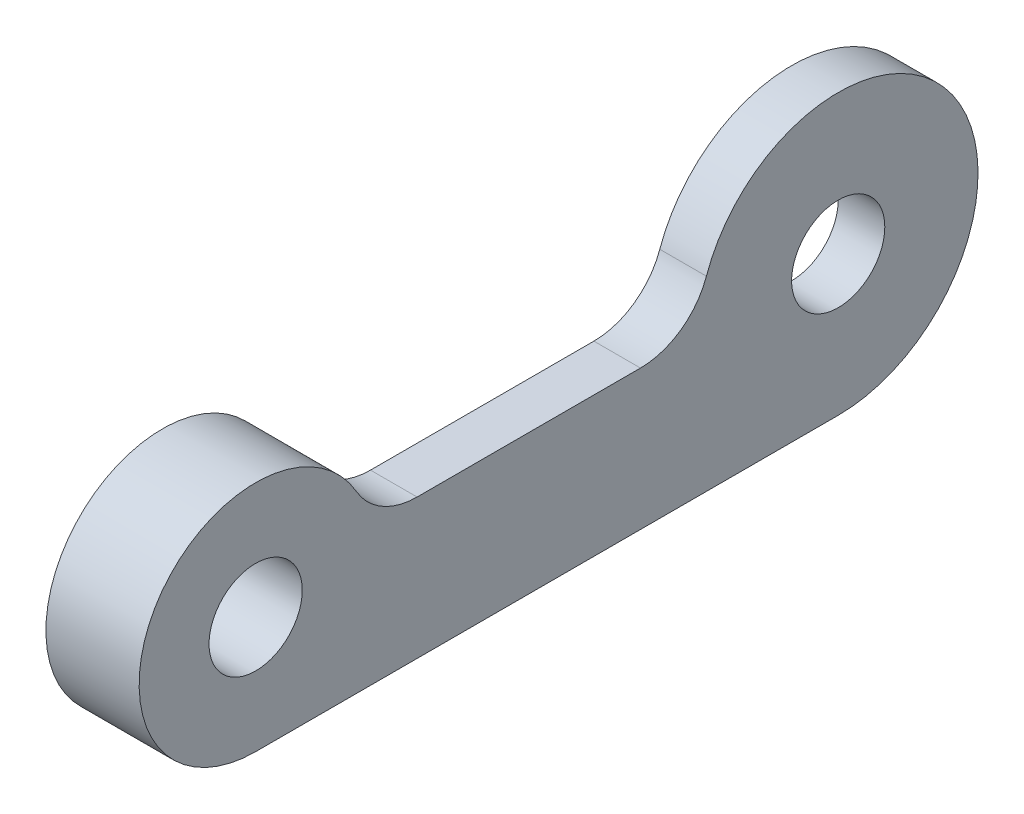
ISO-10303-21;
HEADER;
FILE_DESCRIPTION(('STEP AP214'),'2;1');
FILE_NAME('part.step','',(''),(''),'','','');
FILE_SCHEMA(('AUTOMOTIVE_DESIGN { 1 0 10303 214 1 1 1 1 }'));
ENDSEC;
DATA;
#1=APPLICATION_CONTEXT('core data for automotive mechanical design processes');
#2=APPLICATION_PROTOCOL_DEFINITION('international standard','automotive_design',2000,#1);
#3=PRODUCT_CONTEXT('',#1,'mechanical');
#4=PRODUCT('Part','Part','',(#3));
#5=PRODUCT_RELATED_PRODUCT_CATEGORY('part','',(#4));
#6=PRODUCT_DEFINITION_FORMATION('','',#4);
#7=PRODUCT_DEFINITION_CONTEXT('part definition',#1,'design');
#8=PRODUCT_DEFINITION('design','',#6,#7);
#9=PRODUCT_DEFINITION_SHAPE('','',#8);
#10=(LENGTH_UNIT() NAMED_UNIT(*) SI_UNIT(.MILLI.,.METRE.));
#11=(NAMED_UNIT(*) PLANE_ANGLE_UNIT() SI_UNIT($,.RADIAN.));
#12=(NAMED_UNIT(*) SI_UNIT($,.STERADIAN.) SOLID_ANGLE_UNIT());
#13=UNCERTAINTY_MEASURE_WITH_UNIT(LENGTH_MEASURE(1.E-05),#10,'distance_accuracy_value','');
#14=(GEOMETRIC_REPRESENTATION_CONTEXT(3) GLOBAL_UNCERTAINTY_ASSIGNED_CONTEXT((#13)) GLOBAL_UNIT_ASSIGNED_CONTEXT((#10,
#11,#12)) REPRESENTATION_CONTEXT('',''));
#15=CARTESIAN_POINT('',(0.,0.,0.));
#16=DIRECTION('',(0.,0.,1.));
#17=DIRECTION('',(1.,0.,0.));
#18=AXIS2_PLACEMENT_3D('',#15,#16,#17);
#19=CARTESIAN_POINT('',(2.,-1.,0.));
#20=DIRECTION('',(1.,0.,0.));
#21=DIRECTION('',(0.,0.,-1.));
#22=AXIS2_PLACEMENT_3D('',#19,#20,#21);
#23=PLANE('',#22);
#24=CARTESIAN_POINT('',(2.,-1.,0.));
#25=DIRECTION('',(1.,0.,0.));
#26=DIRECTION('',(0.,0.,-1.));
#27=AXIS2_PLACEMENT_3D('',#24,#25,#26);
#28=CIRCLE('',#27,2.);
#29=CARTESIAN_POINT('',(2.,-1.,-2.));
#30=VERTEX_POINT('',#29);
#31=EDGE_CURVE('E169',#30,#30,#28,.T.);
#32=ORIENTED_EDGE('',*,*,#31,.F.);
#33=EDGE_LOOP('',(#32));
#34=FACE_BOUND('',#33,.T.);
#35=CARTESIAN_POINT('',(2.,0.,-25.));
#36=DIRECTION('',(1.,0.,0.));
#37=DIRECTION('',(0.,0.,-1.));
#38=AXIS2_PLACEMENT_3D('',#35,#36,#37);
#39=CIRCLE('',#38,2.);
#40=CARTESIAN_POINT('',(2.,0.,-27.));
#41=VERTEX_POINT('',#40);
#42=EDGE_CURVE('E233',#41,#41,#39,.T.);
#43=ORIENTED_EDGE('',*,*,#42,.F.);
#44=EDGE_LOOP('',(#43));
#45=FACE_BOUND('',#44,.T.);
#46=DIRECTION('',(0.,0.,-1.));
#47=VECTOR('',#46,1.);
#48=CARTESIAN_POINT('',(2.,-6.,0.));
#49=LINE('',#48,#47);
#50=CARTESIAN_POINT('',(2.,-5.99999999999999,0.));
#51=VERTEX_POINT('',#50);
#52=CARTESIAN_POINT('',(2.,-6.,-25.));
#53=VERTEX_POINT('',#52);
#54=EDGE_CURVE('E137',#51,#53,#49,.T.);
#55=ORIENTED_EDGE('',*,*,#54,.T.);
#56=CARTESIAN_POINT('',(2.,0.,-25.));
#57=DIRECTION('',(1.,0.,0.));
#58=DIRECTION('',(0.,0.,-1.));
#59=AXIS2_PLACEMENT_3D('',#56,#57,#58);
#60=CIRCLE('',#59,6.);
#61=CARTESIAN_POINT('',(2.,2.,-19.3431457505076));
#62=VERTEX_POINT('',#61);
#63=EDGE_CURVE('E147',#53,#62,#60,.T.);
#64=ORIENTED_EDGE('',*,*,#63,.T.);
#65=CARTESIAN_POINT('',(2.,3.,-16.5147186257614));
#66=DIRECTION('',(1.,0.,0.));
#67=DIRECTION('',(0.,0.,-1.));
#68=AXIS2_PLACEMENT_3D('',#65,#66,#67);
#69=CIRCLE('',#68,3.);
#70=CARTESIAN_POINT('',(2.,0.,-16.5147186257614));
#71=VERTEX_POINT('',#70);
#72=EDGE_CURVE('E184',#62,#71,#69,.F.);
#73=ORIENTED_EDGE('',*,*,#72,.T.);
#74=DIRECTION('',(0.,0.,-1.));
#75=VECTOR('',#74,1.);
#76=CARTESIAN_POINT('',(2.,0.,0.));
#77=LINE('',#76,#75);
#78=CARTESIAN_POINT('',(2.,0.,-6.9282032302755));
#79=VERTEX_POINT('',#78);
#80=EDGE_CURVE('E156',#79,#71,#77,.T.);
#81=ORIENTED_EDGE('',*,*,#80,.F.);
#82=CARTESIAN_POINT('',(2.,3.,-6.9282032302755));
#83=DIRECTION('',(1.,0.,0.));
#84=DIRECTION('',(0.,0.,-1.));
#85=AXIS2_PLACEMENT_3D('',#82,#83,#84);
#86=CIRCLE('',#85,3.);
#87=CARTESIAN_POINT('',(2.,1.5,-4.33012701892218));
#88=VERTEX_POINT('',#87);
#89=EDGE_CURVE('E12',#79,#88,#86,.F.);
#90=ORIENTED_EDGE('',*,*,#89,.T.);
#91=CARTESIAN_POINT('',(2.,-1.,0.));
#92=DIRECTION('',(1.,0.,0.));
#93=DIRECTION('',(0.,0.,-1.));
#94=AXIS2_PLACEMENT_3D('',#91,#92,#93);
#95=CIRCLE('',#94,4.99999999999999);
#96=EDGE_CURVE('E139',#88,#51,#95,.T.);
#97=ORIENTED_EDGE('',*,*,#96,.T.);
#98=EDGE_LOOP('',(#55,#64,#73,#81,#90,#97));
#99=FACE_BOUND('',#98,.T.);
#100=ADVANCED_FACE('F69',(#34,#45,#99),#23,.T.);
#101=CARTESIAN_POINT('',(2.,-1.,0.));
#102=DIRECTION('',(-1.,0.,0.));
#103=DIRECTION('',(0.,0.,1.));
#104=AXIS2_PLACEMENT_3D('',#101,#102,#103);
#105=CYLINDRICAL_SURFACE('',#104,4.99999999999999);
#106=ORIENTED_EDGE('',*,*,#96,.F.);
#107=DIRECTION('',(-1.,0.,0.));
#108=VECTOR('',#107,1.);
#109=CARTESIAN_POINT('',(2.,1.5,-4.33012701892218));
#110=LINE('',#109,#108);
#111=CARTESIAN_POINT('',(0.,1.5,-4.33012701892218));
#112=VERTEX_POINT('',#111);
#113=EDGE_CURVE('E128',#88,#112,#110,.T.);
#114=ORIENTED_EDGE('',*,*,#113,.T.);
#115=CARTESIAN_POINT('',(0.,-1.,0.));
#116=DIRECTION('',(1.,0.,0.));
#117=DIRECTION('',(0.,0.,-1.));
#118=AXIS2_PLACEMENT_3D('',#115,#116,#117);
#119=CIRCLE('',#118,4.99999999999999);
#120=CARTESIAN_POINT('',(0.,-5.99999999999999,0.));
#121=VERTEX_POINT('',#120);
#122=EDGE_CURVE('E85',#121,#112,#119,.T.);
#123=ORIENTED_EDGE('',*,*,#122,.F.);
#124=DIRECTION('',(-1.,0.,0.));
#125=VECTOR('',#124,1.);
#126=CARTESIAN_POINT('',(2.,-6.,0.));
#127=LINE('',#126,#125);
#128=EDGE_CURVE('E125',#51,#121,#127,.T.);
#129=ORIENTED_EDGE('',*,*,#128,.F.);
#130=EDGE_LOOP('',(#106,#114,#123,#129));
#131=FACE_BOUND('',#130,.T.);
#132=CARTESIAN_POINT('',(-2.,-1.,0.));
#133=DIRECTION('',(1.,0.,0.));
#134=DIRECTION('',(0.,0.,-1.));
#135=AXIS2_PLACEMENT_3D('',#132,#133,#134);
#136=CIRCLE('',#135,4.99999999999999);
#137=CARTESIAN_POINT('',(-2.,-1.,-4.99999999999999));
#138=VERTEX_POINT('',#137);
#139=EDGE_CURVE('E164',#138,#138,#136,.T.);
#140=ORIENTED_EDGE('',*,*,#139,.T.);
#141=EDGE_LOOP('',(#140));
#142=FACE_BOUND('',#141,.T.);
#143=ADVANCED_FACE('F123',(#131,#142),#105,.T.);
#144=CARTESIAN_POINT('',(0.,-1.,0.));
#145=DIRECTION('',(1.,0.,0.));
#146=DIRECTION('',(0.,0.,-1.));
#147=AXIS2_PLACEMENT_3D('',#144,#145,#146);
#148=PLANE('',#147);
#149=CARTESIAN_POINT('',(0.,0.,-25.));
#150=DIRECTION('',(1.,0.,0.));
#151=DIRECTION('',(0.,0.,-1.));
#152=AXIS2_PLACEMENT_3D('',#149,#150,#151);
#153=CIRCLE('',#152,2.);
#154=CARTESIAN_POINT('',(0.,0.,-27.));
#155=VERTEX_POINT('',#154);
#156=EDGE_CURVE('E165',#155,#155,#153,.F.);
#157=ORIENTED_EDGE('',*,*,#156,.F.);
#158=EDGE_LOOP('',(#157));
#159=FACE_BOUND('',#158,.T.);
#160=DIRECTION('',(0.,0.,-1.));
#161=VECTOR('',#160,1.);
#162=CARTESIAN_POINT('',(0.,-6.,0.));
#163=LINE('',#162,#161);
#164=CARTESIAN_POINT('',(0.,-6.,-25.));
#165=VERTEX_POINT('',#164);
#166=EDGE_CURVE('E135',#121,#165,#163,.T.);
#167=ORIENTED_EDGE('',*,*,#166,.F.);
#168=ORIENTED_EDGE('',*,*,#122,.T.);
#169=CARTESIAN_POINT('',(0.,3.,-6.9282032302755));
#170=DIRECTION('',(1.,0.,0.));
#171=DIRECTION('',(0.,0.,-1.));
#172=AXIS2_PLACEMENT_3D('',#169,#170,#171);
#173=CIRCLE('',#172,3.);
#174=CARTESIAN_POINT('',(0.,0.,-6.9282032302755));
#175=VERTEX_POINT('',#174);
#176=EDGE_CURVE('E78',#112,#175,#173,.T.);
#177=ORIENTED_EDGE('',*,*,#176,.T.);
#178=DIRECTION('',(0.,0.,-1.));
#179=VECTOR('',#178,1.);
#180=CARTESIAN_POINT('',(0.,0.,0.));
#181=LINE('',#180,#179);
#182=CARTESIAN_POINT('',(0.,0.,-16.5147186257614));
#183=VERTEX_POINT('',#182);
#184=EDGE_CURVE('E146',#175,#183,#181,.T.);
#185=ORIENTED_EDGE('',*,*,#184,.T.);
#186=CARTESIAN_POINT('',(0.,3.,-16.5147186257614));
#187=DIRECTION('',(1.,0.,0.));
#188=DIRECTION('',(0.,0.,-1.));
#189=AXIS2_PLACEMENT_3D('',#186,#187,#188);
#190=CIRCLE('',#189,3.);
#191=CARTESIAN_POINT('',(0.,2.,-19.3431457505076));
#192=VERTEX_POINT('',#191);
#193=EDGE_CURVE('E181',#183,#192,#190,.T.);
#194=ORIENTED_EDGE('',*,*,#193,.T.);
#195=CARTESIAN_POINT('',(0.,0.,-25.));
#196=DIRECTION('',(1.,0.,0.));
#197=DIRECTION('',(0.,0.,-1.));
#198=AXIS2_PLACEMENT_3D('',#195,#196,#197);
#199=CIRCLE('',#198,6.);
#200=EDGE_CURVE('E144',#165,#192,#199,.T.);
#201=ORIENTED_EDGE('',*,*,#200,.F.);
#202=EDGE_LOOP('',(#167,#168,#177,#185,#194,#201));
#203=FACE_BOUND('',#202,.T.);
#204=ADVANCED_FACE('F142',(#159,#203),#148,.F.);
#205=CARTESIAN_POINT('',(2.,0.,-25.));
#206=DIRECTION('',(-1.,0.,0.));
#207=DIRECTION('',(0.,0.,1.));
#208=AXIS2_PLACEMENT_3D('',#205,#206,#207);
#209=CYLINDRICAL_SURFACE('',#208,6.);
#210=ORIENTED_EDGE('',*,*,#200,.T.);
#211=DIRECTION('',(-1.,0.,0.));
#212=VECTOR('',#211,1.);
#213=CARTESIAN_POINT('',(2.,2.,-19.3431457505076));
#214=LINE('',#213,#212);
#215=EDGE_CURVE('E176',#192,#62,#214,.F.);
#216=ORIENTED_EDGE('',*,*,#215,.T.);
#217=ORIENTED_EDGE('',*,*,#63,.F.);
#218=DIRECTION('',(-1.,0.,0.));
#219=VECTOR('',#218,1.);
#220=CARTESIAN_POINT('',(2.,-6.,-25.));
#221=LINE('',#220,#219);
#222=EDGE_CURVE('E159',#53,#165,#221,.T.);
#223=ORIENTED_EDGE('',*,*,#222,.T.);
#224=EDGE_LOOP('',(#210,#216,#217,#223));
#225=FACE_BOUND('',#224,.T.);
#226=ADVANCED_FACE('F207',(#225),#209,.T.);
#227=CARTESIAN_POINT('',(2.,0.,0.));
#228=DIRECTION('',(0.,1.,0.));
#229=DIRECTION('',(0.,0.,1.));
#230=AXIS2_PLACEMENT_3D('',#227,#228,#229);
#231=PLANE('',#230);
#232=ORIENTED_EDGE('',*,*,#80,.T.);
#233=DIRECTION('',(-1.,0.,0.));
#234=VECTOR('',#233,1.);
#235=CARTESIAN_POINT('',(2.,0.,-16.5147186257614));
#236=LINE('',#235,#234);
#237=EDGE_CURVE('E172',#71,#183,#236,.T.);
#238=ORIENTED_EDGE('',*,*,#237,.T.);
#239=ORIENTED_EDGE('',*,*,#184,.F.);
#240=DIRECTION('',(-1.,0.,0.));
#241=VECTOR('',#240,1.);
#242=CARTESIAN_POINT('',(2.,0.,-6.9282032302755));
#243=LINE('',#242,#241);
#244=EDGE_CURVE('E130',#175,#79,#243,.F.);
#245=ORIENTED_EDGE('',*,*,#244,.T.);
#246=EDGE_LOOP('',(#232,#238,#239,#245));
#247=FACE_BOUND('',#246,.T.);
#248=ADVANCED_FACE('F192',(#247),#231,.T.);
#249=CARTESIAN_POINT('',(2.,-6.,0.));
#250=DIRECTION('',(0.,1.,0.));
#251=DIRECTION('',(0.,0.,1.));
#252=AXIS2_PLACEMENT_3D('',#249,#250,#251);
#253=PLANE('',#252);
#254=ORIENTED_EDGE('',*,*,#166,.T.);
#255=ORIENTED_EDGE('',*,*,#222,.F.);
#256=ORIENTED_EDGE('',*,*,#54,.F.);
#257=ORIENTED_EDGE('',*,*,#128,.T.);
#258=EDGE_LOOP('',(#254,#255,#256,#257));
#259=FACE_BOUND('',#258,.T.);
#260=ADVANCED_FACE('F134',(#259),#253,.F.);
#261=CARTESIAN_POINT('',(-2.,-1.,0.));
#262=DIRECTION('',(1.,0.,0.));
#263=DIRECTION('',(0.,0.,-1.));
#264=AXIS2_PLACEMENT_3D('',#261,#262,#263);
#265=PLANE('',#264);
#266=CARTESIAN_POINT('',(-2.,-1.,0.));
#267=DIRECTION('',(1.,0.,0.));
#268=DIRECTION('',(0.,0.,-1.));
#269=AXIS2_PLACEMENT_3D('',#266,#267,#268);
#270=CIRCLE('',#269,2.);
#271=CARTESIAN_POINT('',(-2.,-1.,-2.));
#272=VERTEX_POINT('',#271);
#273=EDGE_CURVE('E237',#272,#272,#270,.T.);
#274=ORIENTED_EDGE('',*,*,#273,.T.);
#275=EDGE_LOOP('',(#274));
#276=FACE_BOUND('',#275,.T.);
#277=ORIENTED_EDGE('',*,*,#139,.F.);
#278=EDGE_LOOP('',(#277));
#279=FACE_BOUND('',#278,.T.);
#280=ADVANCED_FACE('F212',(#276,#279),#265,.F.);
#281=CARTESIAN_POINT('',(2.,-1.,0.));
#282=DIRECTION('',(-1.,0.,0.));
#283=DIRECTION('',(0.,0.,1.));
#284=AXIS2_PLACEMENT_3D('',#281,#282,#283);
#285=CYLINDRICAL_SURFACE('',#284,2.);
#286=ORIENTED_EDGE('',*,*,#31,.T.);
#287=EDGE_LOOP('',(#286));
#288=FACE_BOUND('',#287,.T.);
#289=ORIENTED_EDGE('',*,*,#273,.F.);
#290=EDGE_LOOP('',(#289));
#291=FACE_BOUND('',#290,.T.);
#292=ADVANCED_FACE('F247',(#288,#291),#285,.F.);
#293=CARTESIAN_POINT('',(2.,0.,-25.));
#294=DIRECTION('',(-1.,0.,0.));
#295=DIRECTION('',(0.,0.,1.));
#296=AXIS2_PLACEMENT_3D('',#293,#294,#295);
#297=CYLINDRICAL_SURFACE('',#296,2.);
#298=ORIENTED_EDGE('',*,*,#42,.T.);
#299=EDGE_LOOP('',(#298));
#300=FACE_BOUND('',#299,.T.);
#301=ORIENTED_EDGE('',*,*,#156,.T.);
#302=EDGE_LOOP('',(#301));
#303=FACE_BOUND('',#302,.T.);
#304=ADVANCED_FACE('F199',(#300,#303),#297,.F.);
#305=CARTESIAN_POINT('',(2.,3.,-16.5147186257614));
#306=DIRECTION('',(-1.,0.,0.));
#307=DIRECTION('',(0.,0.,1.));
#308=AXIS2_PLACEMENT_3D('',#305,#306,#307);
#309=CYLINDRICAL_SURFACE('',#308,3.);
#310=ORIENTED_EDGE('',*,*,#72,.F.);
#311=ORIENTED_EDGE('',*,*,#215,.F.);
#312=ORIENTED_EDGE('',*,*,#193,.F.);
#313=ORIENTED_EDGE('',*,*,#237,.F.);
#314=EDGE_LOOP('',(#310,#311,#312,#313));
#315=FACE_BOUND('',#314,.T.);
#316=ADVANCED_FACE('F195',(#315),#309,.F.);
#317=CARTESIAN_POINT('',(2.,3.,-6.9282032302755));
#318=DIRECTION('',(-1.,0.,0.));
#319=DIRECTION('',(0.,0.,1.));
#320=AXIS2_PLACEMENT_3D('',#317,#318,#319);
#321=CYLINDRICAL_SURFACE('',#320,3.);
#322=ORIENTED_EDGE('',*,*,#89,.F.);
#323=ORIENTED_EDGE('',*,*,#244,.F.);
#324=ORIENTED_EDGE('',*,*,#176,.F.);
#325=ORIENTED_EDGE('',*,*,#113,.F.);
#326=EDGE_LOOP('',(#322,#323,#324,#325));
#327=FACE_BOUND('',#326,.T.);
#328=ADVANCED_FACE('F71',(#327),#321,.F.);
#329=CLOSED_SHELL('',(#100,#143,#204,#226,#248,#260,#280,#292,#304,#316,#328));
#330=MANIFOLD_SOLID_BREP('B2',#329);
#331=ADVANCED_BREP_SHAPE_REPRESENTATION('',(#18,#330),#14);
#332=SHAPE_DEFINITION_REPRESENTATION(#9,#331);
ENDSEC;
END-ISO-10303-21;
